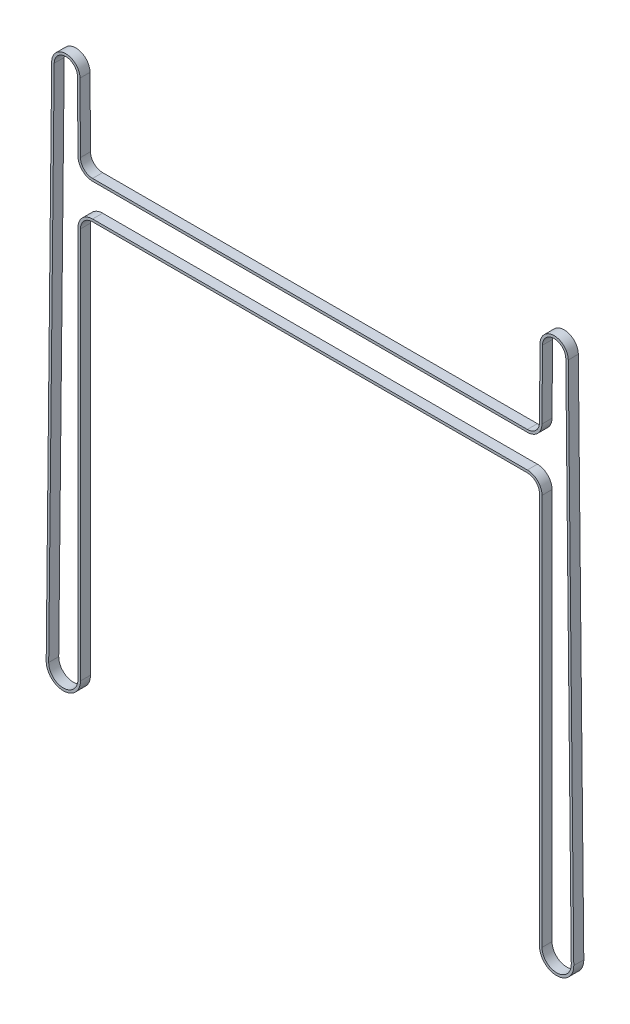
ISO-10303-21;
HEADER;
FILE_DESCRIPTION(('STEP AP214'),'2;1');
FILE_NAME('part.step','',(''),(''),'','','');
FILE_SCHEMA(('AUTOMOTIVE_DESIGN { 1 0 10303 214 1 1 1 1 }'));
ENDSEC;
DATA;
#1=APPLICATION_CONTEXT('core data for automotive mechanical design processes');
#2=APPLICATION_PROTOCOL_DEFINITION('international standard','automotive_design',2000,#1);
#3=PRODUCT_CONTEXT('',#1,'mechanical');
#4=PRODUCT('Part','Part','',(#3));
#5=PRODUCT_RELATED_PRODUCT_CATEGORY('part','',(#4));
#6=PRODUCT_DEFINITION_FORMATION('','',#4);
#7=PRODUCT_DEFINITION_CONTEXT('part definition',#1,'design');
#8=PRODUCT_DEFINITION('design','',#6,#7);
#9=PRODUCT_DEFINITION_SHAPE('','',#8);
#10=(LENGTH_UNIT() NAMED_UNIT(*) SI_UNIT(.MILLI.,.METRE.));
#11=(NAMED_UNIT(*) PLANE_ANGLE_UNIT() SI_UNIT($,.RADIAN.));
#12=(NAMED_UNIT(*) SI_UNIT($,.STERADIAN.) SOLID_ANGLE_UNIT());
#13=UNCERTAINTY_MEASURE_WITH_UNIT(LENGTH_MEASURE(1.E-05),#10,'distance_accuracy_value','');
#14=(GEOMETRIC_REPRESENTATION_CONTEXT(3) GLOBAL_UNCERTAINTY_ASSIGNED_CONTEXT((#13)) GLOBAL_UNIT_ASSIGNED_CONTEXT((#10,
#11,#12)) REPRESENTATION_CONTEXT('',''));
#15=CARTESIAN_POINT('',(0.,0.,0.));
#16=DIRECTION('',(0.,0.,1.));
#17=DIRECTION('',(1.,0.,0.));
#18=AXIS2_PLACEMENT_3D('',#15,#16,#17);
#19=CARTESIAN_POINT('',(-5.81688696446276,2.18861852378392,6.));
#20=DIRECTION('',(0.,0.,-1.));
#21=DIRECTION('',(-1.,0.,0.));
#22=AXIS2_PLACEMENT_3D('',#19,#20,#21);
#23=PLANE('',#22);
#24=CARTESIAN_POINT('',(-5.81688696446276,2.18861852378392,6.));
#25=DIRECTION('',(0.,0.,-1.));
#26=DIRECTION('',(-1.,0.,0.));
#27=AXIS2_PLACEMENT_3D('',#24,#25,#26);
#28=CIRCLE('',#27,8.465);
#29=CARTESIAN_POINT('',(2.64764356001897,2.27777008079258,6.));
#30=VERTEX_POINT('',#29);
#31=CARTESIAN_POINT('',(-14.2816831060449,2.24736613187476,6.));
#32=VERTEX_POINT('',#31);
#33=EDGE_CURVE('E461',#30,#32,#28,.F.);
#34=ORIENTED_EDGE('',*,*,#33,.T.);
#35=DIRECTION('',(-0.006940060022544,-0.999975917493458,0.));
#36=VECTOR('',#35,1.);
#37=CARTESIAN_POINT('',(-14.2816831060449,2.24736613187475,6.));
#38=LINE('',#37,#36);
#39=CARTESIAN_POINT('',(-14.5660615867172,-38.7280189803477,6.));
#40=VERTEX_POINT('',#39);
#41=EDGE_CURVE('E464',#32,#40,#38,.T.);
#42=ORIENTED_EDGE('',*,*,#41,.T.);
#43=CARTESIAN_POINT('',(-21.8168869644622,-38.6776966051242,6.));
#44=DIRECTION('',(0.,0.,-1.));
#45=DIRECTION('',(-1.,0.,0.));
#46=AXIS2_PLACEMENT_3D('',#43,#44,#45);
#47=CIRCLE('',#46,7.251);
#48=CARTESIAN_POINT('',(-21.8168869644622,-45.9286966051242,6.));
#49=VERTEX_POINT('',#48);
#50=EDGE_CURVE('E467',#40,#49,#47,.T.);
#51=ORIENTED_EDGE('',*,*,#50,.T.);
#52=DIRECTION('',(-1.,0.,0.));
#53=VECTOR('',#52,1.);
#54=CARTESIAN_POINT('',(-5.81688696446274,-45.9286966051242,6.));
#55=LINE('',#54,#53);
#56=CARTESIAN_POINT('',(-281.816886964462,-45.9286966051243,6.));
#57=VERTEX_POINT('',#56);
#58=EDGE_CURVE('E469',#49,#57,#55,.T.);
#59=ORIENTED_EDGE('',*,*,#58,.T.);
#60=CARTESIAN_POINT('',(-281.816886964462,-38.6776966051243,6.));
#61=DIRECTION('',(0.,0.,-1.));
#62=DIRECTION('',(-1.,0.,0.));
#63=AXIS2_PLACEMENT_3D('',#60,#61,#62);
#64=CIRCLE('',#63,7.251);
#65=CARTESIAN_POINT('',(-289.067712342207,-38.7280189803476,6.));
#66=VERTEX_POINT('',#65);
#67=EDGE_CURVE('E471',#57,#66,#64,.T.);
#68=ORIENTED_EDGE('',*,*,#67,.T.);
#69=DIRECTION('',(-0.00694006002252125,0.999975917493458,0.));
#70=VECTOR('',#69,1.);
#71=CARTESIAN_POINT('',(-289.338026808409,0.220917408438306,6.));
#72=LINE('',#71,#70);
#73=CARTESIAN_POINT('',(-289.352090822879,2.24736613187441,6.));
#74=VERTEX_POINT('',#73);
#75=EDGE_CURVE('E473',#66,#74,#72,.T.);
#76=ORIENTED_EDGE('',*,*,#75,.T.);
#77=CARTESIAN_POINT('',(-297.816886964461,2.18861852378376,6.));
#78=DIRECTION('',(0.,0.,-1.));
#79=DIRECTION('',(-1.,0.,0.));
#80=AXIS2_PLACEMENT_3D('',#77,#78,#79);
#81=CIRCLE('',#80,8.46500000000001);
#82=CARTESIAN_POINT('',(-306.281417488943,2.27777008079249,6.));
#83=VERTEX_POINT('',#82);
#84=EDGE_CURVE('E475',#74,#83,#81,.F.);
#85=ORIENTED_EDGE('',*,*,#84,.T.);
#86=DIRECTION('',(-0.0105317846436769,-0.999944539218161,0.));
#87=VECTOR('',#86,1.);
#88=CARTESIAN_POINT('',(-306.249029290511,5.35288063925121,6.));
#89=LINE('',#88,#87);
#90=CARTESIAN_POINT('',(-309.567318435986,-309.703420151832,6.));
#91=VERTEX_POINT('',#90);
#92=EDGE_CURVE('E477',#83,#91,#89,.T.);
#93=ORIENTED_EDGE('',*,*,#92,.T.);
#94=CARTESIAN_POINT('',(-299.316886964461,-309.811381476214,6.));
#95=DIRECTION('',(0.,0.,-1.));
#96=DIRECTION('',(-1.,0.,0.));
#97=AXIS2_PLACEMENT_3D('',#94,#95,#96);
#98=CIRCLE('',#97,10.251);
#99=CARTESIAN_POINT('',(-289.065886964835,-309.811293910828,6.));
#100=VERTEX_POINT('',#99);
#101=EDGE_CURVE('E479',#91,#100,#98,.F.);
#102=ORIENTED_EDGE('',*,*,#101,.T.);
#103=DIRECTION('',(-8.54213113766495E-06,0.999999999963516,0.));
#104=VECTOR('',#103,1.);
#105=CARTESIAN_POINT('',(-289.068552088333,2.18619895091538,6.));
#106=LINE('',#105,#104);
#107=CARTESIAN_POINT('',(-289.067886964198,-75.677758544118,6.));
#108=VERTEX_POINT('',#107);
#109=EDGE_CURVE('E481',#100,#108,#106,.T.);
#110=ORIENTED_EDGE('',*,*,#109,.T.);
#111=CARTESIAN_POINT('',(-281.816886964462,-75.6776966051251,6.));
#112=DIRECTION('',(0.,0.,-1.));
#113=DIRECTION('',(-1.,0.,0.));
#114=AXIS2_PLACEMENT_3D('',#111,#112,#113);
#115=CIRCLE('',#114,7.25099999999999);
#116=CARTESIAN_POINT('',(-281.816886964462,-68.4266966051251,6.));
#117=VERTEX_POINT('',#116);
#118=EDGE_CURVE('E483',#108,#117,#115,.T.);
#119=ORIENTED_EDGE('',*,*,#118,.T.);
#120=DIRECTION('',(1.,0.,0.));
#121=VECTOR('',#120,1.);
#122=CARTESIAN_POINT('',(-5.81688696446282,-68.4266966051254,6.));
#123=LINE('',#122,#121);
#124=CARTESIAN_POINT('',(-21.8168869644621,-68.4266966051254,6.));
#125=VERTEX_POINT('',#124);
#126=EDGE_CURVE('E485',#117,#125,#123,.T.);
#127=ORIENTED_EDGE('',*,*,#126,.T.);
#128=CARTESIAN_POINT('',(-21.8168869644621,-75.6776966051254,6.));
#129=DIRECTION('',(0.,0.,-1.));
#130=DIRECTION('',(-1.,0.,0.));
#131=AXIS2_PLACEMENT_3D('',#128,#129,#130);
#132=CIRCLE('',#131,7.251);
#133=CARTESIAN_POINT('',(-14.5658869647267,-75.6777585441183,6.));
#134=VERTEX_POINT('',#133);
#135=EDGE_CURVE('E487',#125,#134,#132,.T.);
#136=ORIENTED_EDGE('',*,*,#135,.T.);
#137=DIRECTION('',(-8.54213114354037E-06,-0.999999999963516,0.));
#138=VECTOR('',#137,1.);
#139=CARTESIAN_POINT('',(-14.5652218192837,2.18869325320754,6.));
#140=LINE('',#139,#138);
#141=CARTESIAN_POINT('',(-14.567886964091,-309.811293910828,6.));
#142=VERTEX_POINT('',#141);
#143=EDGE_CURVE('E489',#134,#142,#140,.T.);
#144=ORIENTED_EDGE('',*,*,#143,.T.);
#145=CARTESIAN_POINT('',(-4.31688696446496,-309.811381476215,6.));
#146=DIRECTION('',(0.,0.,-1.));
#147=DIRECTION('',(-1.,0.,0.));
#148=AXIS2_PLACEMENT_3D('',#145,#146,#147);
#149=CIRCLE('',#148,10.251);
#150=CARTESIAN_POINT('',(5.9335445070604,-309.703420151832,6.));
#151=VERTEX_POINT('',#150);
#152=EDGE_CURVE('E491',#142,#151,#149,.F.);
#153=ORIENTED_EDGE('',*,*,#152,.T.);
#154=DIRECTION('',(-0.01053178464367,0.999944539218161,0.));
#155=VECTOR('',#154,1.);
#156=CARTESIAN_POINT('',(2.64764356001897,2.27777008079258,6.));
#157=LINE('',#156,#155);
#158=EDGE_CURVE('E493',#151,#30,#157,.T.);
#159=ORIENTED_EDGE('',*,*,#158,.T.);
#160=EDGE_LOOP('',(#34,#42,#51,#59,#68,#76,#85,#93,#102,#110,#119,#127,#136,#144,#153,#159));
#161=FACE_BOUND('',#160,.T.);
#162=CARTESIAN_POINT('',(-5.81688696446276,2.18861852378392,6.));
#163=DIRECTION('',(0.,0.,1.));
#164=DIRECTION('',(-1.,0.,0.));
#165=AXIS2_PLACEMENT_3D('',#162,#163,#164);
#166=CIRCLE('',#165,6.965);
#167=CARTESIAN_POINT('',(1.14772675119173,2.26197240382708,6.));
#168=VERTEX_POINT('',#167);
#169=CARTESIAN_POINT('',(-12.7817192298047,2.23695604184093,6.));
#170=VERTEX_POINT('',#169);
#171=EDGE_CURVE('E340',#168,#170,#166,.T.);
#172=ORIENTED_EDGE('',*,*,#171,.F.);
#173=DIRECTION('',(-0.01053178464367,0.999944539218161,0.));
#174=VECTOR('',#173,1.);
#175=CARTESIAN_POINT('',(1.14772675119173,2.26197240382708,6.));
#176=LINE('',#175,#174);
#177=CARTESIAN_POINT('',(4.43362769823316,-309.719217828798,6.));
#178=VERTEX_POINT('',#177);
#179=EDGE_CURVE('E389',#178,#168,#176,.T.);
#180=ORIENTED_EDGE('',*,*,#179,.F.);
#181=CARTESIAN_POINT('',(-4.31688696446496,-309.811381476215,6.));
#182=DIRECTION('',(0.,0.,1.));
#183=DIRECTION('',(-1.,0.,0.));
#184=AXIS2_PLACEMENT_3D('',#181,#182,#183);
#185=CIRCLE('',#184,8.751);
#186=CARTESIAN_POINT('',(-13.0678869641457,-309.811306724025,6.));
#187=VERTEX_POINT('',#186);
#188=EDGE_CURVE('E387',#187,#178,#185,.T.);
#189=ORIENTED_EDGE('',*,*,#188,.F.);
#190=DIRECTION('',(-8.54213114354037E-06,-0.999999999963516,0.));
#191=VECTOR('',#190,1.);
#192=CARTESIAN_POINT('',(-13.0678869641457,-309.811306724025,6.));
#193=LINE('',#192,#191);
#194=CARTESIAN_POINT('',(-13.0658869647814,-75.677771357315,6.));
#195=VERTEX_POINT('',#194);
#196=EDGE_CURVE('E385',#195,#187,#193,.T.);
#197=ORIENTED_EDGE('',*,*,#196,.F.);
#198=CARTESIAN_POINT('',(-21.8168869644621,-75.6776966051254,6.));
#199=DIRECTION('',(0.,0.,-1.));
#200=DIRECTION('',(1.,0.,0.));
#201=AXIS2_PLACEMENT_3D('',#198,#199,#200);
#202=CIRCLE('',#201,8.751);
#203=CARTESIAN_POINT('',(-21.8168869644621,-66.9266966051254,6.));
#204=VERTEX_POINT('',#203);
#205=EDGE_CURVE('E383',#204,#195,#202,.T.);
#206=ORIENTED_EDGE('',*,*,#205,.F.);
#207=DIRECTION('',(1.,0.,0.));
#208=VECTOR('',#207,1.);
#209=CARTESIAN_POINT('',(-21.8168869644621,-66.9266966051254,6.));
#210=LINE('',#209,#208);
#211=CARTESIAN_POINT('',(-281.816886964462,-66.9266966051252,6.));
#212=VERTEX_POINT('',#211);
#213=EDGE_CURVE('E381',#212,#204,#210,.T.);
#214=ORIENTED_EDGE('',*,*,#213,.F.);
#215=CARTESIAN_POINT('',(-281.816886964462,-75.6776966051251,6.));
#216=DIRECTION('',(0.,0.,-1.));
#217=DIRECTION('',(1.,0.,0.));
#218=AXIS2_PLACEMENT_3D('',#215,#216,#217);
#219=CIRCLE('',#218,8.75099999999999);
#220=CARTESIAN_POINT('',(-290.567886964143,-75.6777713573147,6.));
#221=VERTEX_POINT('',#220);
#222=EDGE_CURVE('E379',#221,#212,#219,.T.);
#223=ORIENTED_EDGE('',*,*,#222,.F.);
#224=DIRECTION('',(-8.54213113766495E-06,0.999999999963516,0.));
#225=VECTOR('',#224,1.);
#226=CARTESIAN_POINT('',(-290.567886964143,-75.6777713573147,6.));
#227=LINE('',#226,#225);
#228=CARTESIAN_POINT('',(-290.56588696478,-309.811306724025,6.));
#229=VERTEX_POINT('',#228);
#230=EDGE_CURVE('E377',#229,#221,#227,.T.);
#231=ORIENTED_EDGE('',*,*,#230,.F.);
#232=CARTESIAN_POINT('',(-299.316886964461,-309.811381476214,6.));
#233=DIRECTION('',(0.,0.,1.));
#234=DIRECTION('',(-1.,0.,0.));
#235=AXIS2_PLACEMENT_3D('',#232,#233,#234);
#236=CIRCLE('',#235,8.75099999999998);
#237=CARTESIAN_POINT('',(-308.067401627159,-309.719217828797,6.));
#238=VERTEX_POINT('',#237);
#239=EDGE_CURVE('E375',#238,#229,#236,.T.);
#240=ORIENTED_EDGE('',*,*,#239,.F.);
#241=DIRECTION('',(-0.0105317846436769,-0.99994453921816,0.));
#242=VECTOR('',#241,1.);
#243=CARTESIAN_POINT('',(-308.067401627159,-309.719217828797,6.));
#244=LINE('',#243,#242);
#245=CARTESIAN_POINT('',(-304.781500680115,2.26197240382697,6.));
#246=VERTEX_POINT('',#245);
#247=EDGE_CURVE('E373',#246,#238,#244,.T.);
#248=ORIENTED_EDGE('',*,*,#247,.F.);
#249=CARTESIAN_POINT('',(-297.816886964461,2.18861852378376,6.));
#250=DIRECTION('',(0.,0.,1.));
#251=DIRECTION('',(-1.,0.,0.));
#252=AXIS2_PLACEMENT_3D('',#249,#250,#251);
#253=CIRCLE('',#252,6.96500000000001);
#254=CARTESIAN_POINT('',(-290.852054699119,2.23695604184063,6.));
#255=VERTEX_POINT('',#254);
#256=EDGE_CURVE('E371',#255,#246,#253,.T.);
#257=ORIENTED_EDGE('',*,*,#256,.F.);
#258=DIRECTION('',(-0.00694006002252125,0.999975917493458,0.));
#259=VECTOR('',#258,1.);
#260=CARTESIAN_POINT('',(-290.852054699119,2.23695604184063,6.));
#261=LINE('',#260,#259);
#262=CARTESIAN_POINT('',(-290.567676218448,-38.7384290703814,6.));
#263=VERTEX_POINT('',#262);
#264=EDGE_CURVE('E369',#263,#255,#261,.T.);
#265=ORIENTED_EDGE('',*,*,#264,.F.);
#266=CARTESIAN_POINT('',(-281.816886964462,-38.6776966051243,6.));
#267=DIRECTION('',(0.,0.,-1.));
#268=DIRECTION('',(1.,0.,0.));
#269=AXIS2_PLACEMENT_3D('',#266,#267,#268);
#270=CIRCLE('',#269,8.751);
#271=CARTESIAN_POINT('',(-281.816886964462,-47.4286966051243,6.));
#272=VERTEX_POINT('',#271);
#273=EDGE_CURVE('E367',#272,#263,#270,.T.);
#274=ORIENTED_EDGE('',*,*,#273,.F.);
#275=DIRECTION('',(-1.,0.,0.));
#276=VECTOR('',#275,1.);
#277=CARTESIAN_POINT('',(-281.816886964462,-47.4286966051243,6.));
#278=LINE('',#277,#276);
#279=CARTESIAN_POINT('',(-21.8168869644622,-47.4286966051242,6.));
#280=VERTEX_POINT('',#279);
#281=EDGE_CURVE('E363',#280,#272,#278,.T.);
#282=ORIENTED_EDGE('',*,*,#281,.F.);
#283=CARTESIAN_POINT('',(-21.8168869644622,-38.6776966051242,6.));
#284=DIRECTION('',(0.,0.,-1.));
#285=DIRECTION('',(1.,0.,0.));
#286=AXIS2_PLACEMENT_3D('',#283,#284,#285);
#287=CIRCLE('',#286,8.751);
#288=CARTESIAN_POINT('',(-13.066097710477,-38.7384290703815,6.));
#289=VERTEX_POINT('',#288);
#290=EDGE_CURVE('E361',#289,#280,#287,.T.);
#291=ORIENTED_EDGE('',*,*,#290,.F.);
#292=DIRECTION('',(-0.006940060022544,-0.999975917493458,0.));
#293=VECTOR('',#292,1.);
#294=CARTESIAN_POINT('',(-13.066097710477,-38.7384290703815,6.));
#295=LINE('',#294,#293);
#296=EDGE_CURVE('E348',#170,#289,#295,.T.);
#297=ORIENTED_EDGE('',*,*,#296,.F.);
#298=EDGE_LOOP('',(#172,#180,#189,#197,#206,#214,#223,#231,#240,#248,#257,#265,#274,#282,#291,#297));
#299=FACE_BOUND('',#298,.T.);
#300=ADVANCED_FACE('F131',(#161,#299),#23,.F.);
#301=CARTESIAN_POINT('',(-5.81688696446276,2.18861852378392,0.));
#302=DIRECTION('',(0.,0.,-1.));
#303=DIRECTION('',(-1.,0.,0.));
#304=AXIS2_PLACEMENT_3D('',#301,#302,#303);
#305=PLANE('',#304);
#306=CARTESIAN_POINT('',(-5.81688696446276,2.18861852378392,0.));
#307=DIRECTION('',(0.,0.,-1.));
#308=DIRECTION('',(-1.,0.,0.));
#309=AXIS2_PLACEMENT_3D('',#306,#307,#308);
#310=CIRCLE('',#309,8.465);
#311=CARTESIAN_POINT('',(2.64764356001897,2.27777008079258,0.));
#312=VERTEX_POINT('',#311);
#313=CARTESIAN_POINT('',(-14.2816831060449,2.24736613187476,0.));
#314=VERTEX_POINT('',#313);
#315=EDGE_CURVE('E356',#312,#314,#310,.F.);
#316=ORIENTED_EDGE('',*,*,#315,.F.);
#317=DIRECTION('',(-0.01053178464367,0.999944539218161,0.));
#318=VECTOR('',#317,1.);
#319=CARTESIAN_POINT('',(2.64764356001897,2.27777008079258,0.));
#320=LINE('',#319,#318);
#321=CARTESIAN_POINT('',(5.9335445070604,-309.703420151832,0.));
#322=VERTEX_POINT('',#321);
#323=EDGE_CURVE('E465',#322,#312,#320,.T.);
#324=ORIENTED_EDGE('',*,*,#323,.F.);
#325=CARTESIAN_POINT('',(-4.31688696446496,-309.811381476215,0.));
#326=DIRECTION('',(0.,0.,-1.));
#327=DIRECTION('',(-1.,0.,0.));
#328=AXIS2_PLACEMENT_3D('',#325,#326,#327);
#329=CIRCLE('',#328,10.251);
#330=CARTESIAN_POINT('',(-14.567886964091,-309.811293910828,0.));
#331=VERTEX_POINT('',#330);
#332=EDGE_CURVE('E524',#331,#322,#329,.F.);
#333=ORIENTED_EDGE('',*,*,#332,.F.);
#334=DIRECTION('',(-8.54213114354037E-06,-0.999999999963516,0.));
#335=VECTOR('',#334,1.);
#336=CARTESIAN_POINT('',(-14.5652218192837,2.18869325320754,0.));
#337=LINE('',#336,#335);
#338=CARTESIAN_POINT('',(-14.5658869647267,-75.6777585441183,0.));
#339=VERTEX_POINT('',#338);
#340=EDGE_CURVE('E522',#339,#331,#337,.T.);
#341=ORIENTED_EDGE('',*,*,#340,.F.);
#342=CARTESIAN_POINT('',(-21.8168869644621,-75.6776966051254,0.));
#343=DIRECTION('',(0.,0.,-1.));
#344=DIRECTION('',(-1.,0.,0.));
#345=AXIS2_PLACEMENT_3D('',#342,#343,#344);
#346=CIRCLE('',#345,7.251);
#347=CARTESIAN_POINT('',(-21.8168869644621,-68.4266966051254,0.));
#348=VERTEX_POINT('',#347);
#349=EDGE_CURVE('E520',#348,#339,#346,.T.);
#350=ORIENTED_EDGE('',*,*,#349,.F.);
#351=DIRECTION('',(1.,0.,0.));
#352=VECTOR('',#351,1.);
#353=CARTESIAN_POINT('',(-5.81688696446282,-68.4266966051254,0.));
#354=LINE('',#353,#352);
#355=CARTESIAN_POINT('',(-281.816886964462,-68.4266966051251,0.));
#356=VERTEX_POINT('',#355);
#357=EDGE_CURVE('E518',#356,#348,#354,.T.);
#358=ORIENTED_EDGE('',*,*,#357,.F.);
#359=CARTESIAN_POINT('',(-281.816886964462,-75.6776966051251,0.));
#360=DIRECTION('',(0.,0.,-1.));
#361=DIRECTION('',(-1.,0.,0.));
#362=AXIS2_PLACEMENT_3D('',#359,#360,#361);
#363=CIRCLE('',#362,7.25099999999999);
#364=CARTESIAN_POINT('',(-289.067886964198,-75.677758544118,0.));
#365=VERTEX_POINT('',#364);
#366=EDGE_CURVE('E516',#365,#356,#363,.T.);
#367=ORIENTED_EDGE('',*,*,#366,.F.);
#368=DIRECTION('',(-8.54213113766495E-06,0.999999999963516,0.));
#369=VECTOR('',#368,1.);
#370=CARTESIAN_POINT('',(-289.068552088333,2.18619895091538,0.));
#371=LINE('',#370,#369);
#372=CARTESIAN_POINT('',(-289.065886964835,-309.811293910828,0.));
#373=VERTEX_POINT('',#372);
#374=EDGE_CURVE('E514',#373,#365,#371,.T.);
#375=ORIENTED_EDGE('',*,*,#374,.F.);
#376=CARTESIAN_POINT('',(-299.316886964461,-309.811381476214,0.));
#377=DIRECTION('',(0.,0.,-1.));
#378=DIRECTION('',(-1.,0.,0.));
#379=AXIS2_PLACEMENT_3D('',#376,#377,#378);
#380=CIRCLE('',#379,10.251);
#381=CARTESIAN_POINT('',(-309.567318435986,-309.703420151832,0.));
#382=VERTEX_POINT('',#381);
#383=EDGE_CURVE('E512',#382,#373,#380,.F.);
#384=ORIENTED_EDGE('',*,*,#383,.F.);
#385=DIRECTION('',(-0.0105317846436769,-0.999944539218161,0.));
#386=VECTOR('',#385,1.);
#387=CARTESIAN_POINT('',(-306.249029290511,5.35288063925121,0.));
#388=LINE('',#387,#386);
#389=CARTESIAN_POINT('',(-306.281417488943,2.27777008079249,0.));
#390=VERTEX_POINT('',#389);
#391=EDGE_CURVE('E510',#390,#382,#388,.T.);
#392=ORIENTED_EDGE('',*,*,#391,.F.);
#393=CARTESIAN_POINT('',(-297.816886964461,2.18861852378376,0.));
#394=DIRECTION('',(0.,0.,-1.));
#395=DIRECTION('',(-1.,0.,0.));
#396=AXIS2_PLACEMENT_3D('',#393,#394,#395);
#397=CIRCLE('',#396,8.46500000000001);
#398=CARTESIAN_POINT('',(-289.352090822879,2.24736613187441,0.));
#399=VERTEX_POINT('',#398);
#400=EDGE_CURVE('E508',#399,#390,#397,.F.);
#401=ORIENTED_EDGE('',*,*,#400,.F.);
#402=DIRECTION('',(-0.00694006002252125,0.999975917493458,0.));
#403=VECTOR('',#402,1.);
#404=CARTESIAN_POINT('',(-289.338026808409,0.220917408438306,0.));
#405=LINE('',#404,#403);
#406=CARTESIAN_POINT('',(-289.067712342207,-38.7280189803476,0.));
#407=VERTEX_POINT('',#406);
#408=EDGE_CURVE('E506',#407,#399,#405,.T.);
#409=ORIENTED_EDGE('',*,*,#408,.F.);
#410=CARTESIAN_POINT('',(-281.816886964462,-38.6776966051243,0.));
#411=DIRECTION('',(0.,0.,-1.));
#412=DIRECTION('',(-1.,0.,0.));
#413=AXIS2_PLACEMENT_3D('',#410,#411,#412);
#414=CIRCLE('',#413,7.251);
#415=CARTESIAN_POINT('',(-281.816886964462,-45.9286966051243,0.));
#416=VERTEX_POINT('',#415);
#417=EDGE_CURVE('E504',#416,#407,#414,.T.);
#418=ORIENTED_EDGE('',*,*,#417,.F.);
#419=DIRECTION('',(-1.,0.,0.));
#420=VECTOR('',#419,1.);
#421=CARTESIAN_POINT('',(-5.81688696446274,-45.9286966051242,0.));
#422=LINE('',#421,#420);
#423=CARTESIAN_POINT('',(-21.8168869644622,-45.9286966051242,0.));
#424=VERTEX_POINT('',#423);
#425=EDGE_CURVE('E502',#424,#416,#422,.T.);
#426=ORIENTED_EDGE('',*,*,#425,.F.);
#427=CARTESIAN_POINT('',(-21.8168869644622,-38.6776966051242,0.));
#428=DIRECTION('',(0.,0.,-1.));
#429=DIRECTION('',(-1.,0.,0.));
#430=AXIS2_PLACEMENT_3D('',#427,#428,#429);
#431=CIRCLE('',#430,7.251);
#432=CARTESIAN_POINT('',(-14.5660615867172,-38.7280189803477,0.));
#433=VERTEX_POINT('',#432);
#434=EDGE_CURVE('E500',#433,#424,#431,.T.);
#435=ORIENTED_EDGE('',*,*,#434,.F.);
#436=DIRECTION('',(-0.006940060022544,-0.999975917493458,0.));
#437=VECTOR('',#436,1.);
#438=CARTESIAN_POINT('',(-14.2816831060449,2.24736613187475,0.));
#439=LINE('',#438,#437);
#440=EDGE_CURVE('E498',#314,#433,#439,.T.);
#441=ORIENTED_EDGE('',*,*,#440,.F.);
#442=EDGE_LOOP('',(#316,#324,#333,#341,#350,#358,#367,#375,#384,#392,#401,#409,#418,#426,#435,#441));
#443=FACE_BOUND('',#442,.T.);
#444=DIRECTION('',(-0.01053178464367,0.999944539218161,0.));
#445=VECTOR('',#444,1.);
#446=CARTESIAN_POINT('',(1.14772675119173,2.26197240382708,0.));
#447=LINE('',#446,#445);
#448=CARTESIAN_POINT('',(4.43362769823316,-309.719217828798,0.));
#449=VERTEX_POINT('',#448);
#450=CARTESIAN_POINT('',(1.14772675119173,2.26197240382708,0.));
#451=VERTEX_POINT('',#450);
#452=EDGE_CURVE('E349',#449,#451,#447,.T.);
#453=ORIENTED_EDGE('',*,*,#452,.T.);
#454=CARTESIAN_POINT('',(-5.81688696446276,2.18861852378392,0.));
#455=DIRECTION('',(0.,0.,1.));
#456=DIRECTION('',(-1.,0.,0.));
#457=AXIS2_PLACEMENT_3D('',#454,#455,#456);
#458=CIRCLE('',#457,6.965);
#459=CARTESIAN_POINT('',(-12.7817192298047,2.23695604184093,0.));
#460=VERTEX_POINT('',#459);
#461=EDGE_CURVE('E154',#451,#460,#458,.T.);
#462=ORIENTED_EDGE('',*,*,#461,.T.);
#463=DIRECTION('',(-0.006940060022544,-0.999975917493458,0.));
#464=VECTOR('',#463,1.);
#465=CARTESIAN_POINT('',(-13.066097710477,-38.7384290703815,0.));
#466=LINE('',#465,#464);
#467=CARTESIAN_POINT('',(-13.066097710477,-38.7384290703815,0.));
#468=VERTEX_POINT('',#467);
#469=EDGE_CURVE('E355',#460,#468,#466,.T.);
#470=ORIENTED_EDGE('',*,*,#469,.T.);
#471=CARTESIAN_POINT('',(-21.8168869644622,-38.6776966051242,0.));
#472=DIRECTION('',(0.,0.,-1.));
#473=DIRECTION('',(1.,0.,0.));
#474=AXIS2_PLACEMENT_3D('',#471,#472,#473);
#475=CIRCLE('',#474,8.751);
#476=CARTESIAN_POINT('',(-21.8168869644622,-47.4286966051242,0.));
#477=VERTEX_POINT('',#476);
#478=EDGE_CURVE('E393',#468,#477,#475,.T.);
#479=ORIENTED_EDGE('',*,*,#478,.T.);
#480=DIRECTION('',(-1.,0.,0.));
#481=VECTOR('',#480,1.);
#482=CARTESIAN_POINT('',(-281.816886964462,-47.4286966051243,0.));
#483=LINE('',#482,#481);
#484=CARTESIAN_POINT('',(-281.816886964462,-47.4286966051243,0.));
#485=VERTEX_POINT('',#484);
#486=EDGE_CURVE('E396',#477,#485,#483,.T.);
#487=ORIENTED_EDGE('',*,*,#486,.T.);
#488=CARTESIAN_POINT('',(-281.816886964462,-38.6776966051243,0.));
#489=DIRECTION('',(0.,0.,-1.));
#490=DIRECTION('',(1.,0.,0.));
#491=AXIS2_PLACEMENT_3D('',#488,#489,#490);
#492=CIRCLE('',#491,8.751);
#493=CARTESIAN_POINT('',(-290.567676218448,-38.7384290703814,0.));
#494=VERTEX_POINT('',#493);
#495=EDGE_CURVE('E399',#485,#494,#492,.T.);
#496=ORIENTED_EDGE('',*,*,#495,.T.);
#497=DIRECTION('',(-0.00694006002252125,0.999975917493458,0.));
#498=VECTOR('',#497,1.);
#499=CARTESIAN_POINT('',(-290.852054699119,2.23695604184063,0.));
#500=LINE('',#499,#498);
#501=CARTESIAN_POINT('',(-290.852054699119,2.23695604184063,0.));
#502=VERTEX_POINT('',#501);
#503=EDGE_CURVE('E402',#494,#502,#500,.T.);
#504=ORIENTED_EDGE('',*,*,#503,.T.);
#505=CARTESIAN_POINT('',(-297.816886964461,2.18861852378376,0.));
#506=DIRECTION('',(0.,0.,1.));
#507=DIRECTION('',(-1.,0.,0.));
#508=AXIS2_PLACEMENT_3D('',#505,#506,#507);
#509=CIRCLE('',#508,6.96500000000001);
#510=CARTESIAN_POINT('',(-304.781500680115,2.26197240382697,0.));
#511=VERTEX_POINT('',#510);
#512=EDGE_CURVE('E405',#502,#511,#509,.T.);
#513=ORIENTED_EDGE('',*,*,#512,.T.);
#514=DIRECTION('',(-0.0105317846436769,-0.99994453921816,0.));
#515=VECTOR('',#514,1.);
#516=CARTESIAN_POINT('',(-308.067401627159,-309.719217828797,0.));
#517=LINE('',#516,#515);
#518=CARTESIAN_POINT('',(-308.067401627159,-309.719217828797,0.));
#519=VERTEX_POINT('',#518);
#520=EDGE_CURVE('E408',#511,#519,#517,.T.);
#521=ORIENTED_EDGE('',*,*,#520,.T.);
#522=CARTESIAN_POINT('',(-299.316886964461,-309.811381476214,0.));
#523=DIRECTION('',(0.,0.,1.));
#524=DIRECTION('',(-1.,0.,0.));
#525=AXIS2_PLACEMENT_3D('',#522,#523,#524);
#526=CIRCLE('',#525,8.75099999999998);
#527=CARTESIAN_POINT('',(-290.56588696478,-309.811306724025,0.));
#528=VERTEX_POINT('',#527);
#529=EDGE_CURVE('E411',#519,#528,#526,.T.);
#530=ORIENTED_EDGE('',*,*,#529,.T.);
#531=DIRECTION('',(-8.54213113766495E-06,0.999999999963516,0.));
#532=VECTOR('',#531,1.);
#533=CARTESIAN_POINT('',(-290.567886964143,-75.6777713573147,0.));
#534=LINE('',#533,#532);
#535=CARTESIAN_POINT('',(-290.567886964143,-75.6777713573147,0.));
#536=VERTEX_POINT('',#535);
#537=EDGE_CURVE('E414',#528,#536,#534,.T.);
#538=ORIENTED_EDGE('',*,*,#537,.T.);
#539=CARTESIAN_POINT('',(-281.816886964462,-75.6776966051251,0.));
#540=DIRECTION('',(0.,0.,-1.));
#541=DIRECTION('',(1.,0.,0.));
#542=AXIS2_PLACEMENT_3D('',#539,#540,#541);
#543=CIRCLE('',#542,8.75099999999999);
#544=CARTESIAN_POINT('',(-281.816886964462,-66.9266966051252,0.));
#545=VERTEX_POINT('',#544);
#546=EDGE_CURVE('E417',#536,#545,#543,.T.);
#547=ORIENTED_EDGE('',*,*,#546,.T.);
#548=DIRECTION('',(1.,0.,0.));
#549=VECTOR('',#548,1.);
#550=CARTESIAN_POINT('',(-21.8168869644621,-66.9266966051254,0.));
#551=LINE('',#550,#549);
#552=CARTESIAN_POINT('',(-21.8168869644621,-66.9266966051254,0.));
#553=VERTEX_POINT('',#552);
#554=EDGE_CURVE('E420',#545,#553,#551,.T.);
#555=ORIENTED_EDGE('',*,*,#554,.T.);
#556=CARTESIAN_POINT('',(-21.8168869644621,-75.6776966051254,0.));
#557=DIRECTION('',(0.,0.,-1.));
#558=DIRECTION('',(1.,0.,0.));
#559=AXIS2_PLACEMENT_3D('',#556,#557,#558);
#560=CIRCLE('',#559,8.751);
#561=CARTESIAN_POINT('',(-13.0658869647814,-75.677771357315,0.));
#562=VERTEX_POINT('',#561);
#563=EDGE_CURVE('E423',#553,#562,#560,.T.);
#564=ORIENTED_EDGE('',*,*,#563,.T.);
#565=DIRECTION('',(-8.54213114354037E-06,-0.999999999963516,0.));
#566=VECTOR('',#565,1.);
#567=CARTESIAN_POINT('',(-13.0678869641457,-309.811306724025,0.));
#568=LINE('',#567,#566);
#569=CARTESIAN_POINT('',(-13.0678869641457,-309.811306724025,0.));
#570=VERTEX_POINT('',#569);
#571=EDGE_CURVE('E426',#562,#570,#568,.T.);
#572=ORIENTED_EDGE('',*,*,#571,.T.);
#573=CARTESIAN_POINT('',(-4.31688696446496,-309.811381476215,0.));
#574=DIRECTION('',(0.,0.,1.));
#575=DIRECTION('',(-1.,0.,0.));
#576=AXIS2_PLACEMENT_3D('',#573,#574,#575);
#577=CIRCLE('',#576,8.751);
#578=EDGE_CURVE('E429',#570,#449,#577,.T.);
#579=ORIENTED_EDGE('',*,*,#578,.T.);
#580=EDGE_LOOP('',(#453,#462,#470,#479,#487,#496,#504,#513,#521,#530,#538,#547,#555,#564,#572,#579));
#581=FACE_BOUND('',#580,.T.);
#582=ADVANCED_FACE('F578',(#443,#581),#305,.T.);
#583=CARTESIAN_POINT('',(-5.81688696446276,2.18861852378392,6.));
#584=DIRECTION('',(0.,0.,-1.));
#585=DIRECTION('',(-1.,0.,0.));
#586=AXIS2_PLACEMENT_3D('',#583,#584,#585);
#587=CYLINDRICAL_SURFACE('',#586,8.465);
#588=ORIENTED_EDGE('',*,*,#315,.T.);
#589=DIRECTION('',(0.,0.,-1.));
#590=VECTOR('',#589,1.);
#591=CARTESIAN_POINT('',(-14.2816831060449,2.24736613187476,6.));
#592=LINE('',#591,#590);
#593=EDGE_CURVE('E12',#32,#314,#592,.T.);
#594=ORIENTED_EDGE('',*,*,#593,.F.);
#595=ORIENTED_EDGE('',*,*,#33,.F.);
#596=DIRECTION('',(0.,0.,-1.));
#597=VECTOR('',#596,1.);
#598=CARTESIAN_POINT('',(2.64764356001897,2.27777008079258,6.));
#599=LINE('',#598,#597);
#600=EDGE_CURVE('E495',#30,#312,#599,.T.);
#601=ORIENTED_EDGE('',*,*,#600,.T.);
#602=EDGE_LOOP('',(#588,#594,#595,#601));
#603=FACE_BOUND('',#602,.T.);
#604=ADVANCED_FACE('F133',(#603),#587,.T.);
#605=CARTESIAN_POINT('',(-14.2816831060449,2.24736613187475,6.));
#606=DIRECTION('',(0.999975917493458,-0.006940060022544,0.));
#607=DIRECTION('',(0.006940060022544,0.999975917493458,0.));
#608=AXIS2_PLACEMENT_3D('',#605,#606,#607);
#609=PLANE('',#608);
#610=ORIENTED_EDGE('',*,*,#440,.T.);
#611=DIRECTION('',(0.,0.,-1.));
#612=VECTOR('',#611,1.);
#613=CARTESIAN_POINT('',(-14.5660615867172,-38.7280189803477,6.));
#614=LINE('',#613,#612);
#615=EDGE_CURVE('E139',#40,#433,#614,.T.);
#616=ORIENTED_EDGE('',*,*,#615,.F.);
#617=ORIENTED_EDGE('',*,*,#41,.F.);
#618=ORIENTED_EDGE('',*,*,#593,.T.);
#619=EDGE_LOOP('',(#610,#616,#617,#618));
#620=FACE_BOUND('',#619,.T.);
#621=ADVANCED_FACE('F595',(#620),#609,.F.);
#622=CARTESIAN_POINT('',(-21.8168869644622,-38.6776966051242,6.));
#623=DIRECTION('',(0.,0.,-1.));
#624=DIRECTION('',(-1.,0.,0.));
#625=AXIS2_PLACEMENT_3D('',#622,#623,#624);
#626=CYLINDRICAL_SURFACE('',#625,7.251);
#627=ORIENTED_EDGE('',*,*,#434,.T.);
#628=DIRECTION('',(0.,0.,-1.));
#629=VECTOR('',#628,1.);
#630=CARTESIAN_POINT('',(-21.8168869644622,-45.9286966051242,6.));
#631=LINE('',#630,#629);
#632=EDGE_CURVE('E565',#49,#424,#631,.T.);
#633=ORIENTED_EDGE('',*,*,#632,.F.);
#634=ORIENTED_EDGE('',*,*,#50,.F.);
#635=ORIENTED_EDGE('',*,*,#615,.T.);
#636=EDGE_LOOP('',(#627,#633,#634,#635));
#637=FACE_BOUND('',#636,.T.);
#638=ADVANCED_FACE('F572',(#637),#626,.F.);
#639=CARTESIAN_POINT('',(-5.81688696446274,-45.9286966051242,6.));
#640=DIRECTION('',(0.,-1.,0.));
#641=DIRECTION('',(1.,0.,0.));
#642=AXIS2_PLACEMENT_3D('',#639,#640,#641);
#643=PLANE('',#642);
#644=ORIENTED_EDGE('',*,*,#425,.T.);
#645=DIRECTION('',(0.,0.,-1.));
#646=VECTOR('',#645,1.);
#647=CARTESIAN_POINT('',(-281.816886964462,-45.9286966051243,6.));
#648=LINE('',#647,#646);
#649=EDGE_CURVE('E562',#57,#416,#648,.T.);
#650=ORIENTED_EDGE('',*,*,#649,.F.);
#651=ORIENTED_EDGE('',*,*,#58,.F.);
#652=ORIENTED_EDGE('',*,*,#632,.T.);
#653=EDGE_LOOP('',(#644,#650,#651,#652));
#654=FACE_BOUND('',#653,.T.);
#655=ADVANCED_FACE('F584',(#654),#643,.F.);
#656=CARTESIAN_POINT('',(-281.816886964462,-38.6776966051243,6.));
#657=DIRECTION('',(0.,0.,-1.));
#658=DIRECTION('',(-1.,0.,0.));
#659=AXIS2_PLACEMENT_3D('',#656,#657,#658);
#660=CYLINDRICAL_SURFACE('',#659,7.251);
#661=ORIENTED_EDGE('',*,*,#417,.T.);
#662=DIRECTION('',(0.,0.,-1.));
#663=VECTOR('',#662,1.);
#664=CARTESIAN_POINT('',(-289.067712342207,-38.7280189803476,6.));
#665=LINE('',#664,#663);
#666=EDGE_CURVE('E559',#66,#407,#665,.T.);
#667=ORIENTED_EDGE('',*,*,#666,.F.);
#668=ORIENTED_EDGE('',*,*,#67,.F.);
#669=ORIENTED_EDGE('',*,*,#649,.T.);
#670=EDGE_LOOP('',(#661,#667,#668,#669));
#671=FACE_BOUND('',#670,.T.);
#672=ADVANCED_FACE('F588',(#671),#660,.F.);
#673=CARTESIAN_POINT('',(-289.338026808409,0.220917408438306,6.));
#674=DIRECTION('',(-0.999975917493458,-0.00694006002252125,0.));
#675=DIRECTION('',(0.00694006002252125,-0.999975917493458,0.));
#676=AXIS2_PLACEMENT_3D('',#673,#674,#675);
#677=PLANE('',#676);
#678=ORIENTED_EDGE('',*,*,#408,.T.);
#679=DIRECTION('',(0.,0.,-1.));
#680=VECTOR('',#679,1.);
#681=CARTESIAN_POINT('',(-289.352090822879,2.24736613187441,6.));
#682=LINE('',#681,#680);
#683=EDGE_CURVE('E556',#74,#399,#682,.T.);
#684=ORIENTED_EDGE('',*,*,#683,.F.);
#685=ORIENTED_EDGE('',*,*,#75,.F.);
#686=ORIENTED_EDGE('',*,*,#666,.T.);
#687=EDGE_LOOP('',(#678,#684,#685,#686));
#688=FACE_BOUND('',#687,.T.);
#689=ADVANCED_FACE('F648',(#688),#677,.F.);
#690=CARTESIAN_POINT('',(-297.816886964461,2.18861852378376,6.));
#691=DIRECTION('',(0.,0.,-1.));
#692=DIRECTION('',(-1.,0.,0.));
#693=AXIS2_PLACEMENT_3D('',#690,#691,#692);
#694=CYLINDRICAL_SURFACE('',#693,8.46500000000001);
#695=ORIENTED_EDGE('',*,*,#400,.T.);
#696=DIRECTION('',(0.,0.,-1.));
#697=VECTOR('',#696,1.);
#698=CARTESIAN_POINT('',(-306.281417488943,2.27777008079249,6.));
#699=LINE('',#698,#697);
#700=EDGE_CURVE('E553',#83,#390,#699,.T.);
#701=ORIENTED_EDGE('',*,*,#700,.F.);
#702=ORIENTED_EDGE('',*,*,#84,.F.);
#703=ORIENTED_EDGE('',*,*,#683,.T.);
#704=EDGE_LOOP('',(#695,#701,#702,#703));
#705=FACE_BOUND('',#704,.T.);
#706=ADVANCED_FACE('F645',(#705),#694,.T.);
#707=CARTESIAN_POINT('',(-306.249029290511,5.35288063925121,6.));
#708=DIRECTION('',(0.99994453921816,-0.0105317846436769,0.));
#709=DIRECTION('',(0.0105317846436769,0.999944539218161,0.));
#710=AXIS2_PLACEMENT_3D('',#707,#708,#709);
#711=PLANE('',#710);
#712=ORIENTED_EDGE('',*,*,#391,.T.);
#713=DIRECTION('',(0.,0.,-1.));
#714=VECTOR('',#713,1.);
#715=CARTESIAN_POINT('',(-309.567318435986,-309.703420151832,6.));
#716=LINE('',#715,#714);
#717=EDGE_CURVE('E550',#91,#382,#716,.T.);
#718=ORIENTED_EDGE('',*,*,#717,.F.);
#719=ORIENTED_EDGE('',*,*,#92,.F.);
#720=ORIENTED_EDGE('',*,*,#700,.T.);
#721=EDGE_LOOP('',(#712,#718,#719,#720));
#722=FACE_BOUND('',#721,.T.);
#723=ADVANCED_FACE('F641',(#722),#711,.F.);
#724=CARTESIAN_POINT('',(-299.316886964461,-309.811381476214,6.));
#725=DIRECTION('',(0.,0.,-1.));
#726=DIRECTION('',(-1.,0.,0.));
#727=AXIS2_PLACEMENT_3D('',#724,#725,#726);
#728=CYLINDRICAL_SURFACE('',#727,10.251);
#729=ORIENTED_EDGE('',*,*,#383,.T.);
#730=DIRECTION('',(0.,0.,-1.));
#731=VECTOR('',#730,1.);
#732=CARTESIAN_POINT('',(-289.065886964835,-309.811293910828,6.));
#733=LINE('',#732,#731);
#734=EDGE_CURVE('E547',#100,#373,#733,.T.);
#735=ORIENTED_EDGE('',*,*,#734,.F.);
#736=ORIENTED_EDGE('',*,*,#101,.F.);
#737=ORIENTED_EDGE('',*,*,#717,.T.);
#738=EDGE_LOOP('',(#729,#735,#736,#737));
#739=FACE_BOUND('',#738,.T.);
#740=ADVANCED_FACE('F637',(#739),#728,.T.);
#741=CARTESIAN_POINT('',(-289.068552088333,2.18619895091538,6.));
#742=DIRECTION('',(-0.999999999963516,-8.54213113766495E-06,0.));
#743=DIRECTION('',(8.54213113766495E-06,-0.999999999963516,0.));
#744=AXIS2_PLACEMENT_3D('',#741,#742,#743);
#745=PLANE('',#744);
#746=ORIENTED_EDGE('',*,*,#374,.T.);
#747=DIRECTION('',(0.,0.,-1.));
#748=VECTOR('',#747,1.);
#749=CARTESIAN_POINT('',(-289.067886964198,-75.677758544118,6.));
#750=LINE('',#749,#748);
#751=EDGE_CURVE('E544',#108,#365,#750,.T.);
#752=ORIENTED_EDGE('',*,*,#751,.F.);
#753=ORIENTED_EDGE('',*,*,#109,.F.);
#754=ORIENTED_EDGE('',*,*,#734,.T.);
#755=EDGE_LOOP('',(#746,#752,#753,#754));
#756=FACE_BOUND('',#755,.T.);
#757=ADVANCED_FACE('F632',(#756),#745,.F.);
#758=CARTESIAN_POINT('',(-281.816886964462,-75.6776966051251,6.));
#759=DIRECTION('',(0.,0.,-1.));
#760=DIRECTION('',(-1.,0.,0.));
#761=AXIS2_PLACEMENT_3D('',#758,#759,#760);
#762=CYLINDRICAL_SURFACE('',#761,7.25099999999999);
#763=ORIENTED_EDGE('',*,*,#366,.T.);
#764=DIRECTION('',(0.,0.,-1.));
#765=VECTOR('',#764,1.);
#766=CARTESIAN_POINT('',(-281.816886964462,-68.4266966051251,6.));
#767=LINE('',#766,#765);
#768=EDGE_CURVE('E541',#117,#356,#767,.T.);
#769=ORIENTED_EDGE('',*,*,#768,.F.);
#770=ORIENTED_EDGE('',*,*,#118,.F.);
#771=ORIENTED_EDGE('',*,*,#751,.T.);
#772=EDGE_LOOP('',(#763,#769,#770,#771));
#773=FACE_BOUND('',#772,.T.);
#774=ADVANCED_FACE('F626',(#773),#762,.F.);
#775=CARTESIAN_POINT('',(-5.81688696446282,-68.4266966051254,6.));
#776=DIRECTION('',(0.,1.,0.));
#777=DIRECTION('',(-1.,0.,0.));
#778=AXIS2_PLACEMENT_3D('',#775,#776,#777);
#779=PLANE('',#778);
#780=ORIENTED_EDGE('',*,*,#357,.T.);
#781=DIRECTION('',(0.,0.,-1.));
#782=VECTOR('',#781,1.);
#783=CARTESIAN_POINT('',(-21.8168869644621,-68.4266966051254,6.));
#784=LINE('',#783,#782);
#785=EDGE_CURVE('E538',#125,#348,#784,.T.);
#786=ORIENTED_EDGE('',*,*,#785,.F.);
#787=ORIENTED_EDGE('',*,*,#126,.F.);
#788=ORIENTED_EDGE('',*,*,#768,.T.);
#789=EDGE_LOOP('',(#780,#786,#787,#788));
#790=FACE_BOUND('',#789,.T.);
#791=ADVANCED_FACE('F622',(#790),#779,.F.);
#792=CARTESIAN_POINT('',(-21.8168869644621,-75.6776966051254,6.));
#793=DIRECTION('',(0.,0.,-1.));
#794=DIRECTION('',(-1.,0.,0.));
#795=AXIS2_PLACEMENT_3D('',#792,#793,#794);
#796=CYLINDRICAL_SURFACE('',#795,7.251);
#797=ORIENTED_EDGE('',*,*,#349,.T.);
#798=DIRECTION('',(0.,0.,-1.));
#799=VECTOR('',#798,1.);
#800=CARTESIAN_POINT('',(-14.5658869647267,-75.6777585441183,6.));
#801=LINE('',#800,#799);
#802=EDGE_CURVE('E535',#134,#339,#801,.T.);
#803=ORIENTED_EDGE('',*,*,#802,.F.);
#804=ORIENTED_EDGE('',*,*,#135,.F.);
#805=ORIENTED_EDGE('',*,*,#785,.T.);
#806=EDGE_LOOP('',(#797,#803,#804,#805));
#807=FACE_BOUND('',#806,.T.);
#808=ADVANCED_FACE('F617',(#807),#796,.F.);
#809=CARTESIAN_POINT('',(-14.5652218192837,2.18869325320754,6.));
#810=DIRECTION('',(0.999999999963516,-8.54213114354037E-06,0.));
#811=DIRECTION('',(8.54213114354037E-06,0.999999999963516,0.));
#812=AXIS2_PLACEMENT_3D('',#809,#810,#811);
#813=PLANE('',#812);
#814=ORIENTED_EDGE('',*,*,#340,.T.);
#815=DIRECTION('',(0.,0.,-1.));
#816=VECTOR('',#815,1.);
#817=CARTESIAN_POINT('',(-14.567886964091,-309.811293910828,6.));
#818=LINE('',#817,#816);
#819=EDGE_CURVE('E532',#142,#331,#818,.T.);
#820=ORIENTED_EDGE('',*,*,#819,.F.);
#821=ORIENTED_EDGE('',*,*,#143,.F.);
#822=ORIENTED_EDGE('',*,*,#802,.T.);
#823=EDGE_LOOP('',(#814,#820,#821,#822));
#824=FACE_BOUND('',#823,.T.);
#825=ADVANCED_FACE('F611',(#824),#813,.F.);
#826=CARTESIAN_POINT('',(-4.31688696446496,-309.811381476215,6.));
#827=DIRECTION('',(0.,0.,-1.));
#828=DIRECTION('',(-1.,0.,0.));
#829=AXIS2_PLACEMENT_3D('',#826,#827,#828);
#830=CYLINDRICAL_SURFACE('',#829,10.251);
#831=ORIENTED_EDGE('',*,*,#332,.T.);
#832=DIRECTION('',(0.,0.,-1.));
#833=VECTOR('',#832,1.);
#834=CARTESIAN_POINT('',(5.9335445070604,-309.703420151832,6.));
#835=LINE('',#834,#833);
#836=EDGE_CURVE('E529',#151,#322,#835,.T.);
#837=ORIENTED_EDGE('',*,*,#836,.F.);
#838=ORIENTED_EDGE('',*,*,#152,.F.);
#839=ORIENTED_EDGE('',*,*,#819,.T.);
#840=EDGE_LOOP('',(#831,#837,#838,#839));
#841=FACE_BOUND('',#840,.T.);
#842=ADVANCED_FACE('F607',(#841),#830,.T.);
#843=CARTESIAN_POINT('',(2.64764356001897,2.27777008079258,6.));
#844=DIRECTION('',(-0.999944539218161,-0.01053178464367,0.));
#845=DIRECTION('',(0.01053178464367,-0.999944539218161,0.));
#846=AXIS2_PLACEMENT_3D('',#843,#844,#845);
#847=PLANE('',#846);
#848=ORIENTED_EDGE('',*,*,#323,.T.);
#849=ORIENTED_EDGE('',*,*,#600,.F.);
#850=ORIENTED_EDGE('',*,*,#158,.F.);
#851=ORIENTED_EDGE('',*,*,#836,.T.);
#852=EDGE_LOOP('',(#848,#849,#850,#851));
#853=FACE_BOUND('',#852,.T.);
#854=ADVANCED_FACE('F602',(#853),#847,.F.);
#855=CARTESIAN_POINT('',(-5.81688696446276,2.18861852378392,6.));
#856=DIRECTION('',(0.,0.,-1.));
#857=DIRECTION('',(-1.,0.,0.));
#858=AXIS2_PLACEMENT_3D('',#855,#856,#857);
#859=CYLINDRICAL_SURFACE('',#858,6.965);
#860=ORIENTED_EDGE('',*,*,#461,.F.);
#861=DIRECTION('',(0.,0.,-1.));
#862=VECTOR('',#861,1.);
#863=CARTESIAN_POINT('',(1.14772675119173,2.26197240382708,6.));
#864=LINE('',#863,#862);
#865=EDGE_CURVE('E344',#168,#451,#864,.T.);
#866=ORIENTED_EDGE('',*,*,#865,.F.);
#867=ORIENTED_EDGE('',*,*,#171,.T.);
#868=DIRECTION('',(0.,0.,-1.));
#869=VECTOR('',#868,1.);
#870=CARTESIAN_POINT('',(-12.7817192298047,2.23695604184093,6.));
#871=LINE('',#870,#869);
#872=EDGE_CURVE('E343',#170,#460,#871,.T.);
#873=ORIENTED_EDGE('',*,*,#872,.T.);
#874=EDGE_LOOP('',(#860,#866,#867,#873));
#875=FACE_BOUND('',#874,.T.);
#876=ADVANCED_FACE('F342',(#875),#859,.F.);
#877=CARTESIAN_POINT('',(-13.066097710477,-38.7384290703815,6.));
#878=DIRECTION('',(0.999975917493458,-0.006940060022544,0.));
#879=DIRECTION('',(0.006940060022544,0.999975917493458,0.));
#880=AXIS2_PLACEMENT_3D('',#877,#878,#879);
#881=PLANE('',#880);
#882=ORIENTED_EDGE('',*,*,#469,.F.);
#883=ORIENTED_EDGE('',*,*,#872,.F.);
#884=ORIENTED_EDGE('',*,*,#296,.T.);
#885=DIRECTION('',(0.,0.,-1.));
#886=VECTOR('',#885,1.);
#887=CARTESIAN_POINT('',(-13.066097710477,-38.7384290703815,6.));
#888=LINE('',#887,#886);
#889=EDGE_CURVE('E357',#289,#468,#888,.T.);
#890=ORIENTED_EDGE('',*,*,#889,.T.);
#891=EDGE_LOOP('',(#882,#883,#884,#890));
#892=FACE_BOUND('',#891,.T.);
#893=ADVANCED_FACE('F352',(#892),#881,.T.);
#894=CARTESIAN_POINT('',(-21.8168869644622,-38.6776966051242,6.));
#895=DIRECTION('',(0.,0.,-1.));
#896=DIRECTION('',(-1.,0.,0.));
#897=AXIS2_PLACEMENT_3D('',#894,#895,#896);
#898=CYLINDRICAL_SURFACE('',#897,8.751);
#899=ORIENTED_EDGE('',*,*,#478,.F.);
#900=ORIENTED_EDGE('',*,*,#889,.F.);
#901=ORIENTED_EDGE('',*,*,#290,.T.);
#902=DIRECTION('',(0.,0.,-1.));
#903=VECTOR('',#902,1.);
#904=CARTESIAN_POINT('',(-21.8168869644622,-47.4286966051242,6.));
#905=LINE('',#904,#903);
#906=EDGE_CURVE('E458',#280,#477,#905,.T.);
#907=ORIENTED_EDGE('',*,*,#906,.T.);
#908=EDGE_LOOP('',(#899,#900,#901,#907));
#909=FACE_BOUND('',#908,.T.);
#910=ADVANCED_FACE('F730',(#909),#898,.T.);
#911=CARTESIAN_POINT('',(-281.816886964462,-47.4286966051243,6.));
#912=DIRECTION('',(0.,-1.,0.));
#913=DIRECTION('',(1.,0.,0.));
#914=AXIS2_PLACEMENT_3D('',#911,#912,#913);
#915=PLANE('',#914);
#916=ORIENTED_EDGE('',*,*,#486,.F.);
#917=ORIENTED_EDGE('',*,*,#906,.F.);
#918=ORIENTED_EDGE('',*,*,#281,.T.);
#919=DIRECTION('',(0.,0.,-1.));
#920=VECTOR('',#919,1.);
#921=CARTESIAN_POINT('',(-281.816886964462,-47.4286966051243,6.));
#922=LINE('',#921,#920);
#923=EDGE_CURVE('E456',#272,#485,#922,.T.);
#924=ORIENTED_EDGE('',*,*,#923,.T.);
#925=EDGE_LOOP('',(#916,#917,#918,#924));
#926=FACE_BOUND('',#925,.T.);
#927=ADVANCED_FACE('F736',(#926),#915,.T.);
#928=CARTESIAN_POINT('',(-281.816886964462,-38.6776966051243,6.));
#929=DIRECTION('',(0.,0.,-1.));
#930=DIRECTION('',(-1.,0.,0.));
#931=AXIS2_PLACEMENT_3D('',#928,#929,#930);
#932=CYLINDRICAL_SURFACE('',#931,8.751);
#933=ORIENTED_EDGE('',*,*,#495,.F.);
#934=ORIENTED_EDGE('',*,*,#923,.F.);
#935=ORIENTED_EDGE('',*,*,#273,.T.);
#936=DIRECTION('',(0.,0.,-1.));
#937=VECTOR('',#936,1.);
#938=CARTESIAN_POINT('',(-290.567676218448,-38.7384290703814,6.));
#939=LINE('',#938,#937);
#940=EDGE_CURVE('E454',#263,#494,#939,.T.);
#941=ORIENTED_EDGE('',*,*,#940,.T.);
#942=EDGE_LOOP('',(#933,#934,#935,#941));
#943=FACE_BOUND('',#942,.T.);
#944=ADVANCED_FACE('F744',(#943),#932,.T.);
#945=CARTESIAN_POINT('',(-290.852054699119,2.23695604184063,6.));
#946=DIRECTION('',(-0.999975917493458,-0.00694006002252125,0.));
#947=DIRECTION('',(0.00694006002252125,-0.999975917493458,0.));
#948=AXIS2_PLACEMENT_3D('',#945,#946,#947);
#949=PLANE('',#948);
#950=ORIENTED_EDGE('',*,*,#503,.F.);
#951=ORIENTED_EDGE('',*,*,#940,.F.);
#952=ORIENTED_EDGE('',*,*,#264,.T.);
#953=DIRECTION('',(0.,0.,-1.));
#954=VECTOR('',#953,1.);
#955=CARTESIAN_POINT('',(-290.852054699119,2.23695604184063,6.));
#956=LINE('',#955,#954);
#957=EDGE_CURVE('E452',#255,#502,#956,.T.);
#958=ORIENTED_EDGE('',*,*,#957,.T.);
#959=EDGE_LOOP('',(#950,#951,#952,#958));
#960=FACE_BOUND('',#959,.T.);
#961=ADVANCED_FACE('F752',(#960),#949,.T.);
#962=CARTESIAN_POINT('',(-297.816886964461,2.18861852378376,6.));
#963=DIRECTION('',(0.,0.,-1.));
#964=DIRECTION('',(-1.,0.,0.));
#965=AXIS2_PLACEMENT_3D('',#962,#963,#964);
#966=CYLINDRICAL_SURFACE('',#965,6.96500000000001);
#967=ORIENTED_EDGE('',*,*,#512,.F.);
#968=ORIENTED_EDGE('',*,*,#957,.F.);
#969=ORIENTED_EDGE('',*,*,#256,.T.);
#970=DIRECTION('',(0.,0.,-1.));
#971=VECTOR('',#970,1.);
#972=CARTESIAN_POINT('',(-304.781500680115,2.26197240382697,6.));
#973=LINE('',#972,#971);
#974=EDGE_CURVE('E450',#246,#511,#973,.T.);
#975=ORIENTED_EDGE('',*,*,#974,.T.);
#976=EDGE_LOOP('',(#967,#968,#969,#975));
#977=FACE_BOUND('',#976,.T.);
#978=ADVANCED_FACE('F760',(#977),#966,.F.);
#979=CARTESIAN_POINT('',(-308.067401627159,-309.719217828797,6.));
#980=DIRECTION('',(0.99994453921816,-0.0105317846436769,0.));
#981=DIRECTION('',(0.0105317846436769,0.999944539218161,0.));
#982=AXIS2_PLACEMENT_3D('',#979,#980,#981);
#983=PLANE('',#982);
#984=ORIENTED_EDGE('',*,*,#520,.F.);
#985=ORIENTED_EDGE('',*,*,#974,.F.);
#986=ORIENTED_EDGE('',*,*,#247,.T.);
#987=DIRECTION('',(0.,0.,-1.));
#988=VECTOR('',#987,1.);
#989=CARTESIAN_POINT('',(-308.067401627159,-309.719217828797,6.));
#990=LINE('',#989,#988);
#991=EDGE_CURVE('E448',#238,#519,#990,.T.);
#992=ORIENTED_EDGE('',*,*,#991,.T.);
#993=EDGE_LOOP('',(#984,#985,#986,#992));
#994=FACE_BOUND('',#993,.T.);
#995=ADVANCED_FACE('F768',(#994),#983,.T.);
#996=CARTESIAN_POINT('',(-299.316886964461,-309.811381476214,6.));
#997=DIRECTION('',(0.,0.,-1.));
#998=DIRECTION('',(-1.,0.,0.));
#999=AXIS2_PLACEMENT_3D('',#996,#997,#998);
#1000=CYLINDRICAL_SURFACE('',#999,8.75099999999998);
#1001=ORIENTED_EDGE('',*,*,#529,.F.);
#1002=ORIENTED_EDGE('',*,*,#991,.F.);
#1003=ORIENTED_EDGE('',*,*,#239,.T.);
#1004=DIRECTION('',(0.,0.,-1.));
#1005=VECTOR('',#1004,1.);
#1006=CARTESIAN_POINT('',(-290.56588696478,-309.811306724025,6.));
#1007=LINE('',#1006,#1005);
#1008=EDGE_CURVE('E446',#229,#528,#1007,.T.);
#1009=ORIENTED_EDGE('',*,*,#1008,.T.);
#1010=EDGE_LOOP('',(#1001,#1002,#1003,#1009));
#1011=FACE_BOUND('',#1010,.T.);
#1012=ADVANCED_FACE('F776',(#1011),#1000,.F.);
#1013=CARTESIAN_POINT('',(-290.567886964143,-75.6777713573147,6.));
#1014=DIRECTION('',(-0.999999999963516,-8.54213113766495E-06,0.));
#1015=DIRECTION('',(8.54213113766495E-06,-0.999999999963516,0.));
#1016=AXIS2_PLACEMENT_3D('',#1013,#1014,#1015);
#1017=PLANE('',#1016);
#1018=ORIENTED_EDGE('',*,*,#537,.F.);
#1019=ORIENTED_EDGE('',*,*,#1008,.F.);
#1020=ORIENTED_EDGE('',*,*,#230,.T.);
#1021=DIRECTION('',(0.,0.,-1.));
#1022=VECTOR('',#1021,1.);
#1023=CARTESIAN_POINT('',(-290.567886964143,-75.6777713573147,6.));
#1024=LINE('',#1023,#1022);
#1025=EDGE_CURVE('E444',#221,#536,#1024,.T.);
#1026=ORIENTED_EDGE('',*,*,#1025,.T.);
#1027=EDGE_LOOP('',(#1018,#1019,#1020,#1026));
#1028=FACE_BOUND('',#1027,.T.);
#1029=ADVANCED_FACE('F784',(#1028),#1017,.T.);
#1030=CARTESIAN_POINT('',(-281.816886964462,-75.6776966051251,6.));
#1031=DIRECTION('',(0.,0.,-1.));
#1032=DIRECTION('',(-1.,0.,0.));
#1033=AXIS2_PLACEMENT_3D('',#1030,#1031,#1032);
#1034=CYLINDRICAL_SURFACE('',#1033,8.75099999999999);
#1035=ORIENTED_EDGE('',*,*,#546,.F.);
#1036=ORIENTED_EDGE('',*,*,#1025,.F.);
#1037=ORIENTED_EDGE('',*,*,#222,.T.);
#1038=DIRECTION('',(0.,0.,-1.));
#1039=VECTOR('',#1038,1.);
#1040=CARTESIAN_POINT('',(-281.816886964462,-66.9266966051252,6.));
#1041=LINE('',#1040,#1039);
#1042=EDGE_CURVE('E442',#212,#545,#1041,.T.);
#1043=ORIENTED_EDGE('',*,*,#1042,.T.);
#1044=EDGE_LOOP('',(#1035,#1036,#1037,#1043));
#1045=FACE_BOUND('',#1044,.T.);
#1046=ADVANCED_FACE('F792',(#1045),#1034,.T.);
#1047=CARTESIAN_POINT('',(-21.8168869644621,-66.9266966051254,6.));
#1048=DIRECTION('',(0.,1.,0.));
#1049=DIRECTION('',(-1.,0.,0.));
#1050=AXIS2_PLACEMENT_3D('',#1047,#1048,#1049);
#1051=PLANE('',#1050);
#1052=ORIENTED_EDGE('',*,*,#554,.F.);
#1053=ORIENTED_EDGE('',*,*,#1042,.F.);
#1054=ORIENTED_EDGE('',*,*,#213,.T.);
#1055=DIRECTION('',(0.,0.,-1.));
#1056=VECTOR('',#1055,1.);
#1057=CARTESIAN_POINT('',(-21.8168869644621,-66.9266966051254,6.));
#1058=LINE('',#1057,#1056);
#1059=EDGE_CURVE('E440',#204,#553,#1058,.T.);
#1060=ORIENTED_EDGE('',*,*,#1059,.T.);
#1061=EDGE_LOOP('',(#1052,#1053,#1054,#1060));
#1062=FACE_BOUND('',#1061,.T.);
#1063=ADVANCED_FACE('F800',(#1062),#1051,.T.);
#1064=CARTESIAN_POINT('',(-21.8168869644621,-75.6776966051254,6.));
#1065=DIRECTION('',(0.,0.,-1.));
#1066=DIRECTION('',(-1.,0.,0.));
#1067=AXIS2_PLACEMENT_3D('',#1064,#1065,#1066);
#1068=CYLINDRICAL_SURFACE('',#1067,8.751);
#1069=ORIENTED_EDGE('',*,*,#563,.F.);
#1070=ORIENTED_EDGE('',*,*,#1059,.F.);
#1071=ORIENTED_EDGE('',*,*,#205,.T.);
#1072=DIRECTION('',(0.,0.,-1.));
#1073=VECTOR('',#1072,1.);
#1074=CARTESIAN_POINT('',(-13.0658869647814,-75.677771357315,6.));
#1075=LINE('',#1074,#1073);
#1076=EDGE_CURVE('E438',#195,#562,#1075,.T.);
#1077=ORIENTED_EDGE('',*,*,#1076,.T.);
#1078=EDGE_LOOP('',(#1069,#1070,#1071,#1077));
#1079=FACE_BOUND('',#1078,.T.);
#1080=ADVANCED_FACE('F808',(#1079),#1068,.T.);
#1081=CARTESIAN_POINT('',(-13.0678869641457,-309.811306724025,6.));
#1082=DIRECTION('',(0.999999999963516,-8.54213114354037E-06,0.));
#1083=DIRECTION('',(8.54213114354037E-06,0.999999999963516,0.));
#1084=AXIS2_PLACEMENT_3D('',#1081,#1082,#1083);
#1085=PLANE('',#1084);
#1086=ORIENTED_EDGE('',*,*,#571,.F.);
#1087=ORIENTED_EDGE('',*,*,#1076,.F.);
#1088=ORIENTED_EDGE('',*,*,#196,.T.);
#1089=DIRECTION('',(0.,0.,-1.));
#1090=VECTOR('',#1089,1.);
#1091=CARTESIAN_POINT('',(-13.0678869641457,-309.811306724025,6.));
#1092=LINE('',#1091,#1090);
#1093=EDGE_CURVE('E436',#187,#570,#1092,.T.);
#1094=ORIENTED_EDGE('',*,*,#1093,.T.);
#1095=EDGE_LOOP('',(#1086,#1087,#1088,#1094));
#1096=FACE_BOUND('',#1095,.T.);
#1097=ADVANCED_FACE('F816',(#1096),#1085,.T.);
#1098=CARTESIAN_POINT('',(-4.31688696446496,-309.811381476215,6.));
#1099=DIRECTION('',(0.,0.,-1.));
#1100=DIRECTION('',(-1.,0.,0.));
#1101=AXIS2_PLACEMENT_3D('',#1098,#1099,#1100);
#1102=CYLINDRICAL_SURFACE('',#1101,8.751);
#1103=ORIENTED_EDGE('',*,*,#578,.F.);
#1104=ORIENTED_EDGE('',*,*,#1093,.F.);
#1105=ORIENTED_EDGE('',*,*,#188,.T.);
#1106=DIRECTION('',(0.,0.,-1.));
#1107=VECTOR('',#1106,1.);
#1108=CARTESIAN_POINT('',(4.43362769823316,-309.719217828798,6.));
#1109=LINE('',#1108,#1107);
#1110=EDGE_CURVE('E146',#178,#449,#1109,.T.);
#1111=ORIENTED_EDGE('',*,*,#1110,.T.);
#1112=EDGE_LOOP('',(#1103,#1104,#1105,#1111));
#1113=FACE_BOUND('',#1112,.T.);
#1114=ADVANCED_FACE('F824',(#1113),#1102,.F.);
#1115=CARTESIAN_POINT('',(1.14772675119173,2.26197240382708,6.));
#1116=DIRECTION('',(-0.999944539218161,-0.01053178464367,0.));
#1117=DIRECTION('',(0.01053178464367,-0.999944539218161,0.));
#1118=AXIS2_PLACEMENT_3D('',#1115,#1116,#1117);
#1119=PLANE('',#1118);
#1120=ORIENTED_EDGE('',*,*,#452,.F.);
#1121=ORIENTED_EDGE('',*,*,#1110,.F.);
#1122=ORIENTED_EDGE('',*,*,#179,.T.);
#1123=ORIENTED_EDGE('',*,*,#865,.T.);
#1124=EDGE_LOOP('',(#1120,#1121,#1122,#1123));
#1125=FACE_BOUND('',#1124,.T.);
#1126=ADVANCED_FACE('F832',(#1125),#1119,.T.);
#1127=CLOSED_SHELL('',(#300,#582,#604,#621,#638,#655,#672,#689,#706,#723,#740,#757,#774,#791,
#808,#825,#842,#854,#876,#893,#910,#927,#944,#961,#978,#995,#1012,#1029,#1046,#1063,#1080,#1097,
#1114,#1126));
#1128=MANIFOLD_SOLID_BREP('B2',#1127);
#1129=ADVANCED_BREP_SHAPE_REPRESENTATION('',(#18,#1128),#14);
#1130=SHAPE_DEFINITION_REPRESENTATION(#9,#1129);
ENDSEC;
END-ISO-10303-21;
